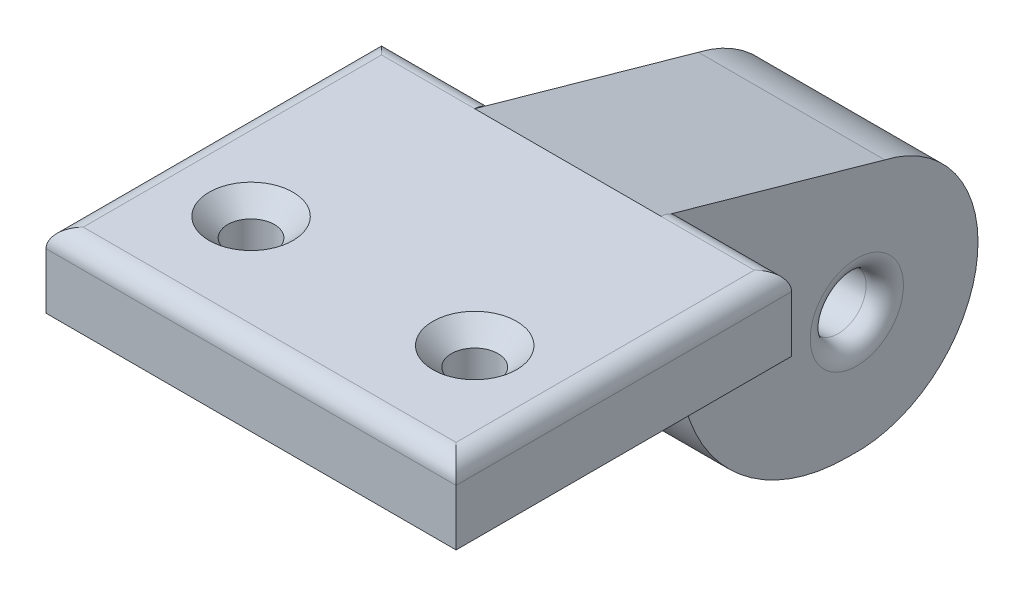
ISO-10303-21;
HEADER;
FILE_DESCRIPTION(('STEP AP214'),'2;1');
FILE_NAME('part.step','',(''),(''),'','','');
FILE_SCHEMA(('AUTOMOTIVE_DESIGN { 1 0 10303 214 1 1 1 1 }'));
ENDSEC;
DATA;
#1=APPLICATION_CONTEXT('core data for automotive mechanical design processes');
#2=APPLICATION_PROTOCOL_DEFINITION('international standard','automotive_design',2000,#1);
#3=PRODUCT_CONTEXT('',#1,'mechanical');
#4=PRODUCT('Part','Part','',(#3));
#5=PRODUCT_RELATED_PRODUCT_CATEGORY('part','',(#4));
#6=PRODUCT_DEFINITION_FORMATION('','',#4);
#7=PRODUCT_DEFINITION_CONTEXT('part definition',#1,'design');
#8=PRODUCT_DEFINITION('design','',#6,#7);
#9=PRODUCT_DEFINITION_SHAPE('','',#8);
#10=(LENGTH_UNIT() NAMED_UNIT(*) SI_UNIT(.MILLI.,.METRE.));
#11=(NAMED_UNIT(*) PLANE_ANGLE_UNIT() SI_UNIT($,.RADIAN.));
#12=(NAMED_UNIT(*) SI_UNIT($,.STERADIAN.) SOLID_ANGLE_UNIT());
#13=UNCERTAINTY_MEASURE_WITH_UNIT(LENGTH_MEASURE(1.E-05),#10,'distance_accuracy_value','');
#14=(GEOMETRIC_REPRESENTATION_CONTEXT(3) GLOBAL_UNCERTAINTY_ASSIGNED_CONTEXT((#13)) GLOBAL_UNIT_ASSIGNED_CONTEXT((#10,
#11,#12)) REPRESENTATION_CONTEXT('',''));
#15=CARTESIAN_POINT('',(0.,0.,0.));
#16=DIRECTION('',(0.,0.,1.));
#17=DIRECTION('',(1.,0.,0.));
#18=AXIS2_PLACEMENT_3D('',#15,#16,#17);
#19=CARTESIAN_POINT('',(0.,0.,0.));
#20=DIRECTION('',(0.,1.,0.));
#21=DIRECTION('',(0.,0.,1.));
#22=AXIS2_PLACEMENT_3D('',#19,#20,#21);
#23=PLANE('',#22);
#24=CARTESIAN_POINT('',(-2.24087591240878,0.,-13.3576642335766));
#25=DIRECTION('',(0.,1.,0.));
#26=DIRECTION('',(0.,0.,1.));
#27=AXIS2_PLACEMENT_3D('',#24,#25,#26);
#28=CIRCLE('',#27,1.2484307583388);
#29=CARTESIAN_POINT('',(-2.24087591240878,0.,-12.1092334752378));
#30=VERTEX_POINT('',#29);
#31=EDGE_CURVE('E350',#30,#30,#28,.T.);
#32=ORIENTED_EDGE('',*,*,#31,.T.);
#33=EDGE_LOOP('',(#32));
#34=FACE_BOUND('',#33,.T.);
#35=CARTESIAN_POINT('',(-14.2408759124088,0.,-13.3576642335766));
#36=DIRECTION('',(0.,1.,0.));
#37=DIRECTION('',(0.,0.,1.));
#38=AXIS2_PLACEMENT_3D('',#35,#36,#37);
#39=CIRCLE('',#38,1.2484307583388);
#40=CARTESIAN_POINT('',(-14.2408759124088,0.,-12.1092334752378));
#41=VERTEX_POINT('',#40);
#42=EDGE_CURVE('E289',#41,#41,#39,.T.);
#43=ORIENTED_EDGE('',*,*,#42,.T.);
#44=EDGE_LOOP('',(#43));
#45=FACE_BOUND('',#44,.T.);
#46=DIRECTION('',(1.,0.,0.));
#47=VECTOR('',#46,1.);
#48=CARTESIAN_POINT('',(0.,0.,-23.3576642335766));
#49=LINE('',#48,#47);
#50=CARTESIAN_POINT('',(-13.2408759124088,0.,-23.3576642335766));
#51=VERTEX_POINT('',#50);
#52=CARTESIAN_POINT('',(-3.24087591240879,0.,-23.3576642335766));
#53=VERTEX_POINT('',#52);
#54=EDGE_CURVE('E293',#51,#53,#49,.T.);
#55=ORIENTED_EDGE('',*,*,#54,.T.);
#56=DIRECTION('',(0.,0.,-1.));
#57=VECTOR('',#56,1.);
#58=CARTESIAN_POINT('',(-3.24087591240878,0.,0.));
#59=LINE('',#58,#57);
#60=CARTESIAN_POINT('',(-3.24087591240879,0.,-25.3576642335766));
#61=VERTEX_POINT('',#60);
#62=EDGE_CURVE('E297',#53,#61,#59,.T.);
#63=ORIENTED_EDGE('',*,*,#62,.T.);
#64=DIRECTION('',(1.,0.,0.));
#65=VECTOR('',#64,1.);
#66=CARTESIAN_POINT('',(0.,0.,-25.3576642335766));
#67=LINE('',#66,#65);
#68=CARTESIAN_POINT('',(2.75912408759122,0.,-25.3576642335766));
#69=VERTEX_POINT('',#68);
#70=EDGE_CURVE('E198',#61,#69,#67,.T.);
#71=ORIENTED_EDGE('',*,*,#70,.T.);
#72=DIRECTION('',(0.,0.,1.));
#73=VECTOR('',#72,1.);
#74=CARTESIAN_POINT('',(2.75912408759122,0.,0.));
#75=LINE('',#74,#73);
#76=CARTESIAN_POINT('',(2.75912408759122,0.,-7.35766423357664));
#77=VERTEX_POINT('',#76);
#78=EDGE_CURVE('E180',#69,#77,#75,.T.);
#79=ORIENTED_EDGE('',*,*,#78,.T.);
#80=DIRECTION('',(1.,0.,0.));
#81=VECTOR('',#80,1.);
#82=CARTESIAN_POINT('',(0.,0.,-7.35766423357664));
#83=LINE('',#82,#81);
#84=CARTESIAN_POINT('',(-19.2408759124088,0.,-7.35766423357664));
#85=VERTEX_POINT('',#84);
#86=EDGE_CURVE('E202',#85,#77,#83,.T.);
#87=ORIENTED_EDGE('',*,*,#86,.F.);
#88=DIRECTION('',(0.,0.,1.));
#89=VECTOR('',#88,1.);
#90=CARTESIAN_POINT('',(-19.2408759124088,0.,0.));
#91=LINE('',#90,#89);
#92=CARTESIAN_POINT('',(-19.2408759124088,0.,-25.3576642335766));
#93=VERTEX_POINT('',#92);
#94=EDGE_CURVE('E367',#93,#85,#91,.T.);
#95=ORIENTED_EDGE('',*,*,#94,.F.);
#96=DIRECTION('',(-1.,0.,0.));
#97=VECTOR('',#96,1.);
#98=CARTESIAN_POINT('',(-16.4817518248176,0.,-25.3576642335766));
#99=LINE('',#98,#97);
#100=CARTESIAN_POINT('',(-13.2408759124088,0.,-25.3576642335766));
#101=VERTEX_POINT('',#100);
#102=EDGE_CURVE('E371',#101,#93,#99,.T.);
#103=ORIENTED_EDGE('',*,*,#102,.F.);
#104=DIRECTION('',(0.,0.,1.));
#105=VECTOR('',#104,1.);
#106=CARTESIAN_POINT('',(-13.2408759124088,0.,0.));
#107=LINE('',#106,#105);
#108=EDGE_CURVE('E273',#101,#51,#107,.T.);
#109=ORIENTED_EDGE('',*,*,#108,.T.);
#110=EDGE_LOOP('',(#55,#63,#71,#79,#87,#95,#103,#109));
#111=FACE_BOUND('',#110,.T.);
#112=ADVANCED_FACE('F43',(#34,#45,#111),#23,.F.);
#113=CARTESIAN_POINT('',(2.75912408759122,4.,0.));
#114=DIRECTION('',(1.,0.,0.));
#115=DIRECTION('',(0.,0.,-1.));
#116=AXIS2_PLACEMENT_3D('',#113,#114,#115);
#117=PLANE('',#116);
#118=DIRECTION('',(0.,-1.,0.));
#119=VECTOR('',#118,1.);
#120=CARTESIAN_POINT('',(2.75912408759122,4.,-25.3576642335766));
#121=LINE('',#120,#119);
#122=CARTESIAN_POINT('',(2.75912408759122,3.,-25.3576642335766));
#123=VERTEX_POINT('',#122);
#124=EDGE_CURVE('E213',#123,#69,#121,.T.);
#125=ORIENTED_EDGE('',*,*,#124,.F.);
#126=DIRECTION('',(0.,0.,1.));
#127=VECTOR('',#126,1.);
#128=CARTESIAN_POINT('',(2.75912408759122,3.,0.));
#129=LINE('',#128,#127);
#130=CARTESIAN_POINT('',(2.75912408759122,3.,-7.35766423357664));
#131=VERTEX_POINT('',#130);
#132=EDGE_CURVE('E236',#123,#131,#129,.T.);
#133=ORIENTED_EDGE('',*,*,#132,.T.);
#134=DIRECTION('',(0.,-1.,0.));
#135=VECTOR('',#134,1.);
#136=CARTESIAN_POINT('',(2.75912408759122,4.,-7.35766423357664));
#137=LINE('',#136,#135);
#138=EDGE_CURVE('E206',#131,#77,#137,.T.);
#139=ORIENTED_EDGE('',*,*,#138,.T.);
#140=ORIENTED_EDGE('',*,*,#78,.F.);
#141=EDGE_LOOP('',(#125,#133,#139,#140));
#142=FACE_BOUND('',#141,.T.);
#143=ADVANCED_FACE('F435',(#142),#117,.T.);
#144=CARTESIAN_POINT('',(0.,4.,-25.3576642335766));
#145=DIRECTION('',(0.,0.,-1.));
#146=DIRECTION('',(-1.,0.,0.));
#147=AXIS2_PLACEMENT_3D('',#144,#145,#146);
#148=PLANE('',#147);
#149=DIRECTION('',(0.,-1.,0.));
#150=VECTOR('',#149,1.);
#151=CARTESIAN_POINT('',(-3.24087591240879,4.,-25.3576642335766));
#152=LINE('',#151,#150);
#153=CARTESIAN_POINT('',(-3.24087591240879,3.,-25.3576642335766));
#154=VERTEX_POINT('',#153);
#155=EDGE_CURVE('E209',#154,#61,#152,.T.);
#156=ORIENTED_EDGE('',*,*,#155,.F.);
#157=DIRECTION('',(1.,0.,0.));
#158=VECTOR('',#157,1.);
#159=CARTESIAN_POINT('',(0.,3.,-25.3576642335766));
#160=LINE('',#159,#158);
#161=EDGE_CURVE('E216',#154,#123,#160,.T.);
#162=ORIENTED_EDGE('',*,*,#161,.T.);
#163=ORIENTED_EDGE('',*,*,#124,.T.);
#164=ORIENTED_EDGE('',*,*,#70,.F.);
#165=EDGE_LOOP('',(#156,#162,#163,#164));
#166=FACE_BOUND('',#165,.T.);
#167=ADVANCED_FACE('F423',(#166),#148,.T.);
#168=CARTESIAN_POINT('',(-3.24087591240878,4.,0.));
#169=DIRECTION('',(-1.,0.,0.));
#170=DIRECTION('',(0.,0.,1.));
#171=AXIS2_PLACEMENT_3D('',#168,#169,#170);
#172=PLANE('',#171);
#173=CARTESIAN_POINT('',(-3.24087591240879,-5.7,-34.8576642335766));
#174=DIRECTION('',(-1.,0.,0.));
#175=DIRECTION('',(0.,0.,1.));
#176=AXIS2_PLACEMENT_3D('',#173,#174,#175);
#177=CIRCLE('',#176,2.5);
#178=CARTESIAN_POINT('',(-3.24087591240879,-5.7,-32.3576642335766));
#179=VERTEX_POINT('',#178);
#180=EDGE_CURVE('E260',#179,#179,#177,.T.);
#181=ORIENTED_EDGE('',*,*,#180,.T.);
#182=EDGE_LOOP('',(#181));
#183=FACE_BOUND('',#182,.T.);
#184=CARTESIAN_POINT('',(-3.24087591240879,-5.7,-34.8576642335766));
#185=DIRECTION('',(1.,0.,0.));
#186=DIRECTION('',(0.,0.,-1.));
#187=AXIS2_PLACEMENT_3D('',#184,#185,#186);
#188=CIRCLE('',#187,6.5);
#189=CARTESIAN_POINT('',(-3.24087591240879,-12.1921305013964,-34.5379119031099));
#190=VERTEX_POINT('',#189);
#191=CARTESIAN_POINT('',(-3.24087591240879,0.624555320336759,-36.3576642335766));
#192=VERTEX_POINT('',#191);
#193=EDGE_CURVE('E176',#190,#192,#188,.T.);
#194=ORIENTED_EDGE('',*,*,#193,.T.);
#195=DIRECTION('',(0.,0.270778634132189,0.962641642199997));
#196=VECTOR('',#195,1.);
#197=CARTESIAN_POINT('',(-3.24087591240879,0.624555320336759,-36.3576642335766));
#198=LINE('',#197,#196);
#199=CARTESIAN_POINT('',(-3.24087591240879,3.85335786259501,-24.878989811644));
#200=VERTEX_POINT('',#199);
#201=EDGE_CURVE('E158',#192,#200,#198,.T.);
#202=ORIENTED_EDGE('',*,*,#201,.T.);
#203=CARTESIAN_POINT('',(-3.24087591240879,3.,-24.3576642335766));
#204=DIRECTION('',(-1.,0.,0.));
#205=DIRECTION('',(0.,0.,1.));
#206=AXIS2_PLACEMENT_3D('',#203,#204,#205);
#207=CIRCLE('',#206,1.);
#208=EDGE_CURVE('E264',#200,#154,#207,.T.);
#209=ORIENTED_EDGE('',*,*,#208,.T.);
#210=ORIENTED_EDGE('',*,*,#155,.T.);
#211=ORIENTED_EDGE('',*,*,#62,.F.);
#212=CARTESIAN_POINT('',(-3.24087591240879,-2.,-23.3576642335766));
#213=DIRECTION('',(-1.,0.,0.));
#214=DIRECTION('',(0.,0.,1.));
#215=AXIS2_PLACEMENT_3D('',#212,#213,#214);
#216=CIRCLE('',#215,2.);
#217=CARTESIAN_POINT('',(-3.24087591240879,-2.,-25.3576642335766));
#218=VERTEX_POINT('',#217);
#219=EDGE_CURVE('E303',#53,#218,#216,.T.);
#220=ORIENTED_EDGE('',*,*,#219,.T.);
#221=DIRECTION('',(0.,-1.,0.));
#222=VECTOR('',#221,1.);
#223=CARTESIAN_POINT('',(-3.24087591240879,0.,-25.3576642335766));
#224=LINE('',#223,#222);
#225=CARTESIAN_POINT('',(-3.24087591240879,-3.19213050139637,-25.3576642335766));
#226=VERTEX_POINT('',#225);
#227=EDGE_CURVE('E191',#218,#226,#224,.T.);
#228=ORIENTED_EDGE('',*,*,#227,.T.);
#229=CARTESIAN_POINT('',(-3.24087591240879,-3.19213050139637,-34.3576642335766));
#230=DIRECTION('',(-1.,0.,0.));
#231=DIRECTION('',(0.,0.,1.));
#232=AXIS2_PLACEMENT_3D('',#229,#230,#231);
#233=CIRCLE('',#232,9.);
#234=CARTESIAN_POINT('',(-3.24087591240879,-12.1921305013964,-34.3576642335766));
#235=VERTEX_POINT('',#234);
#236=EDGE_CURVE('E68',#226,#235,#233,.F.);
#237=ORIENTED_EDGE('',*,*,#236,.T.);
#238=DIRECTION('',(0.,0.,-1.));
#239=VECTOR('',#238,1.);
#240=CARTESIAN_POINT('',(-3.24087591240878,-12.1921305013964,0.));
#241=LINE('',#240,#239);
#242=EDGE_CURVE('E184',#235,#190,#241,.T.);
#243=ORIENTED_EDGE('',*,*,#242,.T.);
#244=EDGE_LOOP('',(#194,#202,#209,#210,#211,#220,#228,#237,#243));
#245=FACE_BOUND('',#244,.T.);
#246=ADVANCED_FACE('F183',(#183,#245),#172,.F.);
#247=CARTESIAN_POINT('',(0.,4.,-7.35766423357664));
#248=DIRECTION('',(0.,0.,-1.));
#249=DIRECTION('',(-1.,0.,0.));
#250=AXIS2_PLACEMENT_3D('',#247,#248,#249);
#251=PLANE('',#250);
#252=ORIENTED_EDGE('',*,*,#138,.F.);
#253=DIRECTION('',(1.,0.,0.));
#254=VECTOR('',#253,1.);
#255=CARTESIAN_POINT('',(-19.2408759124088,3.,-7.35766423357664));
#256=LINE('',#255,#254);
#257=CARTESIAN_POINT('',(-19.2408759124088,3.,-7.35766423357664));
#258=VERTEX_POINT('',#257);
#259=EDGE_CURVE('E239',#131,#258,#256,.F.);
#260=ORIENTED_EDGE('',*,*,#259,.T.);
#261=DIRECTION('',(0.,-1.,0.));
#262=VECTOR('',#261,1.);
#263=CARTESIAN_POINT('',(-19.2408759124088,4.,-7.35766423357664));
#264=LINE('',#263,#262);
#265=EDGE_CURVE('E382',#258,#85,#264,.T.);
#266=ORIENTED_EDGE('',*,*,#265,.T.);
#267=ORIENTED_EDGE('',*,*,#86,.T.);
#268=EDGE_LOOP('',(#252,#260,#266,#267));
#269=FACE_BOUND('',#268,.T.);
#270=ADVANCED_FACE('F439',(#269),#251,.F.);
#271=CARTESIAN_POINT('',(0.,4.,0.));
#272=DIRECTION('',(0.,1.,0.));
#273=DIRECTION('',(0.,0.,1.));
#274=AXIS2_PLACEMENT_3D('',#271,#272,#273);
#275=PLANE('',#274);
#276=CARTESIAN_POINT('',(-14.2408759124088,4.,-13.3576642335766));
#277=DIRECTION('',(0.,1.,0.));
#278=DIRECTION('',(0.,0.,1.));
#279=AXIS2_PLACEMENT_3D('',#276,#277,#278);
#280=CIRCLE('',#279,2.2484307583388);
#281=CARTESIAN_POINT('',(-14.2408759124088,4.,-11.1092334752378));
#282=VERTEX_POINT('',#281);
#283=EDGE_CURVE('E53',#282,#282,#280,.F.);
#284=ORIENTED_EDGE('',*,*,#283,.T.);
#285=EDGE_LOOP('',(#284));
#286=FACE_BOUND('',#285,.T.);
#287=CARTESIAN_POINT('',(-2.24087591240878,4.,-13.3576642335766));
#288=DIRECTION('',(0.,1.,0.));
#289=DIRECTION('',(0.,0.,1.));
#290=AXIS2_PLACEMENT_3D('',#287,#288,#289);
#291=CIRCLE('',#290,2.2484307583388);
#292=CARTESIAN_POINT('',(-2.24087591240878,4.,-11.1092334752378));
#293=VERTEX_POINT('',#292);
#294=EDGE_CURVE('E324',#293,#293,#291,.F.);
#295=ORIENTED_EDGE('',*,*,#294,.T.);
#296=EDGE_LOOP('',(#295));
#297=FACE_BOUND('',#296,.T.);
#298=DIRECTION('',(-1.,0.,0.));
#299=VECTOR('',#298,1.);
#300=CARTESIAN_POINT('',(-3.24087591240879,4.,-24.3576642335766));
#301=LINE('',#300,#299);
#302=CARTESIAN_POINT('',(-3.24087591240879,4.,-24.3576642335766));
#303=VERTEX_POINT('',#302);
#304=CARTESIAN_POINT('',(-13.2408759124088,4.,-24.3576642335766));
#305=VERTEX_POINT('',#304);
#306=EDGE_CURVE('E169',#303,#305,#301,.T.);
#307=ORIENTED_EDGE('',*,*,#306,.T.);
#308=DIRECTION('',(-1.,0.,0.));
#309=VECTOR('',#308,1.);
#310=CARTESIAN_POINT('',(-19.2408759124088,4.,-24.3576642335766));
#311=LINE('',#310,#309);
#312=CARTESIAN_POINT('',(-18.2408759124088,4.,-24.3576642335766));
#313=VERTEX_POINT('',#312);
#314=EDGE_CURVE('E223',#305,#313,#311,.T.);
#315=ORIENTED_EDGE('',*,*,#314,.T.);
#316=DIRECTION('',(0.,0.,1.));
#317=VECTOR('',#316,1.);
#318=CARTESIAN_POINT('',(-18.2408759124088,4.,-7.35766423357664));
#319=LINE('',#318,#317);
#320=CARTESIAN_POINT('',(-18.2408759124088,4.,-8.35766423357664));
#321=VERTEX_POINT('',#320);
#322=EDGE_CURVE('E220',#313,#321,#319,.T.);
#323=ORIENTED_EDGE('',*,*,#322,.T.);
#324=DIRECTION('',(1.,0.,0.));
#325=VECTOR('',#324,1.);
#326=CARTESIAN_POINT('',(2.75912408759122,4.,-8.35766423357664));
#327=LINE('',#326,#325);
#328=CARTESIAN_POINT('',(1.75912408759122,4.,-8.35766423357664));
#329=VERTEX_POINT('',#328);
#330=EDGE_CURVE('E226',#321,#329,#327,.T.);
#331=ORIENTED_EDGE('',*,*,#330,.T.);
#332=DIRECTION('',(0.,0.,1.));
#333=VECTOR('',#332,1.);
#334=CARTESIAN_POINT('',(1.75912408759122,4.,0.));
#335=LINE('',#334,#333);
#336=CARTESIAN_POINT('',(1.75912408759122,4.,-24.3576642335766));
#337=VERTEX_POINT('',#336);
#338=EDGE_CURVE('E229',#329,#337,#335,.F.);
#339=ORIENTED_EDGE('',*,*,#338,.T.);
#340=DIRECTION('',(1.,0.,0.));
#341=VECTOR('',#340,1.);
#342=CARTESIAN_POINT('',(0.,4.,-24.3576642335766));
#343=LINE('',#342,#341);
#344=EDGE_CURVE('E232',#337,#303,#343,.F.);
#345=ORIENTED_EDGE('',*,*,#344,.T.);
#346=EDGE_LOOP('',(#307,#315,#323,#331,#339,#345));
#347=FACE_BOUND('',#346,.T.);
#348=ADVANCED_FACE('F331',(#286,#297,#347),#275,.T.);
#349=CARTESIAN_POINT('',(-8.24087591240879,-5.7,-34.8576642335766));
#350=DIRECTION('',(1.,0.,0.));
#351=DIRECTION('',(0.,0.,-1.));
#352=AXIS2_PLACEMENT_3D('',#349,#350,#351);
#353=CYLINDRICAL_SURFACE('',#352,6.5);
#354=ORIENTED_EDGE('',*,*,#193,.F.);
#355=DIRECTION('',(1.,0.,0.));
#356=VECTOR('',#355,1.);
#357=CARTESIAN_POINT('',(-8.24087591240879,-12.1921305013964,-34.5379119031099));
#358=LINE('',#357,#356);
#359=CARTESIAN_POINT('',(-13.2408759124088,-12.1921305013964,-34.5379119031099));
#360=VERTEX_POINT('',#359);
#361=EDGE_CURVE('E181',#360,#190,#358,.T.);
#362=ORIENTED_EDGE('',*,*,#361,.F.);
#363=CARTESIAN_POINT('',(-13.2408759124088,-5.7,-34.8576642335766));
#364=DIRECTION('',(1.,0.,0.));
#365=DIRECTION('',(0.,0.,-1.));
#366=AXIS2_PLACEMENT_3D('',#363,#364,#365);
#367=CIRCLE('',#366,6.5);
#368=CARTESIAN_POINT('',(-13.2408759124088,0.624555320336759,-36.3576642335766));
#369=VERTEX_POINT('',#368);
#370=EDGE_CURVE('E178',#360,#369,#367,.T.);
#371=ORIENTED_EDGE('',*,*,#370,.T.);
#372=DIRECTION('',(1.,0.,0.));
#373=VECTOR('',#372,1.);
#374=CARTESIAN_POINT('',(-8.24087591240879,0.624555320336759,-36.3576642335766));
#375=LINE('',#374,#373);
#376=EDGE_CURVE('E162',#369,#192,#375,.T.);
#377=ORIENTED_EDGE('',*,*,#376,.T.);
#378=EDGE_LOOP('',(#354,#362,#371,#377));
#379=FACE_BOUND('',#378,.T.);
#380=ADVANCED_FACE('F174',(#379),#353,.T.);
#381=CARTESIAN_POINT('',(-8.24087591240879,-12.1921305013964,0.));
#382=DIRECTION('',(0.,-1.,0.));
#383=DIRECTION('',(0.,0.,-1.));
#384=AXIS2_PLACEMENT_3D('',#381,#382,#383);
#385=PLANE('',#384);
#386=ORIENTED_EDGE('',*,*,#242,.F.);
#387=DIRECTION('',(1.,0.,0.));
#388=VECTOR('',#387,1.);
#389=CARTESIAN_POINT('',(-8.24087591240879,-12.1921305013964,-34.3576642335766));
#390=LINE('',#389,#388);
#391=CARTESIAN_POINT('',(-13.2408759124088,-12.1921305013964,-34.3576642335766));
#392=VERTEX_POINT('',#391);
#393=EDGE_CURVE('E60',#235,#392,#390,.F.);
#394=ORIENTED_EDGE('',*,*,#393,.T.);
#395=DIRECTION('',(0.,0.,-1.));
#396=VECTOR('',#395,1.);
#397=CARTESIAN_POINT('',(-13.2408759124088,-12.1921305013964,0.));
#398=LINE('',#397,#396);
#399=EDGE_CURVE('E360',#392,#360,#398,.T.);
#400=ORIENTED_EDGE('',*,*,#399,.T.);
#401=ORIENTED_EDGE('',*,*,#361,.T.);
#402=EDGE_LOOP('',(#386,#394,#400,#401));
#403=FACE_BOUND('',#402,.T.);
#404=ADVANCED_FACE('F512',(#403),#385,.T.);
#405=CARTESIAN_POINT('',(-8.24087591240879,0.,-25.3576642335766));
#406=DIRECTION('',(0.,0.,1.));
#407=DIRECTION('',(1.,0.,0.));
#408=AXIS2_PLACEMENT_3D('',#405,#406,#407);
#409=PLANE('',#408);
#410=DIRECTION('',(0.,-1.,0.));
#411=VECTOR('',#410,1.);
#412=CARTESIAN_POINT('',(-13.2408759124088,0.,-25.3576642335766));
#413=LINE('',#412,#411);
#414=CARTESIAN_POINT('',(-13.2408759124088,-2.,-25.3576642335766));
#415=VERTEX_POINT('',#414);
#416=CARTESIAN_POINT('',(-13.2408759124088,-3.19213050139637,-25.3576642335766));
#417=VERTEX_POINT('',#416);
#418=EDGE_CURVE('E363',#415,#417,#413,.T.);
#419=ORIENTED_EDGE('',*,*,#418,.T.);
#420=DIRECTION('',(1.,0.,0.));
#421=VECTOR('',#420,1.);
#422=CARTESIAN_POINT('',(-8.24087591240879,-3.19213050139637,-25.3576642335766));
#423=LINE('',#422,#421);
#424=EDGE_CURVE('E309',#417,#226,#423,.T.);
#425=ORIENTED_EDGE('',*,*,#424,.T.);
#426=ORIENTED_EDGE('',*,*,#227,.F.);
#427=DIRECTION('',(1.,0.,0.));
#428=VECTOR('',#427,1.);
#429=CARTESIAN_POINT('',(-8.24087591240879,-2.,-25.3576642335766));
#430=LINE('',#429,#428);
#431=EDGE_CURVE('E300',#218,#415,#430,.F.);
#432=ORIENTED_EDGE('',*,*,#431,.T.);
#433=EDGE_LOOP('',(#419,#425,#426,#432));
#434=FACE_BOUND('',#433,.T.);
#435=ADVANCED_FACE('F389',(#434),#409,.T.);
#436=CARTESIAN_POINT('',(-8.24087591240879,-5.7,-34.8576642335766));
#437=DIRECTION('',(1.,0.,0.));
#438=DIRECTION('',(0.,0.,-1.));
#439=AXIS2_PLACEMENT_3D('',#436,#437,#438);
#440=CYLINDRICAL_SURFACE('',#439,1.5);
#441=CARTESIAN_POINT('',(-12.2408759124088,-5.7,-34.8576642335766));
#442=DIRECTION('',(-1.,0.,0.));
#443=DIRECTION('',(0.,0.,1.));
#444=AXIS2_PLACEMENT_3D('',#441,#442,#443);
#445=CIRCLE('',#444,1.5);
#446=CARTESIAN_POINT('',(-12.2408759124088,-5.7,-33.3576642335766));
#447=VERTEX_POINT('',#446);
#448=EDGE_CURVE('E256',#447,#447,#445,.T.);
#449=ORIENTED_EDGE('',*,*,#448,.T.);
#450=EDGE_LOOP('',(#449));
#451=FACE_BOUND('',#450,.T.);
#452=CARTESIAN_POINT('',(-4.24087591240879,-5.7,-34.8576642335766));
#453=DIRECTION('',(-1.,0.,0.));
#454=DIRECTION('',(0.,0.,1.));
#455=AXIS2_PLACEMENT_3D('',#452,#453,#454);
#456=CIRCLE('',#455,1.5);
#457=CARTESIAN_POINT('',(-4.24087591240879,-5.7,-33.3576642335766));
#458=VERTEX_POINT('',#457);
#459=EDGE_CURVE('E252',#458,#458,#456,.F.);
#460=ORIENTED_EDGE('',*,*,#459,.T.);
#461=EDGE_LOOP('',(#460));
#462=FACE_BOUND('',#461,.T.);
#463=ADVANCED_FACE('F452',(#451,#462),#440,.F.);
#464=CARTESIAN_POINT('',(-19.2408759124088,4.,0.));
#465=DIRECTION('',(1.,0.,0.));
#466=DIRECTION('',(0.,0.,-1.));
#467=AXIS2_PLACEMENT_3D('',#464,#465,#466);
#468=PLANE('',#467);
#469=ORIENTED_EDGE('',*,*,#265,.F.);
#470=DIRECTION('',(0.,0.,1.));
#471=VECTOR('',#470,1.);
#472=CARTESIAN_POINT('',(-19.2408759124088,3.,-25.3576642335766));
#473=LINE('',#472,#471);
#474=CARTESIAN_POINT('',(-19.2408759124088,3.,-25.3576642335766));
#475=VERTEX_POINT('',#474);
#476=EDGE_CURVE('E245',#258,#475,#473,.F.);
#477=ORIENTED_EDGE('',*,*,#476,.T.);
#478=DIRECTION('',(0.,-1.,0.));
#479=VECTOR('',#478,1.);
#480=CARTESIAN_POINT('',(-19.2408759124088,4.,-25.3576642335766));
#481=LINE('',#480,#479);
#482=EDGE_CURVE('E375',#475,#93,#481,.T.);
#483=ORIENTED_EDGE('',*,*,#482,.T.);
#484=ORIENTED_EDGE('',*,*,#94,.T.);
#485=EDGE_LOOP('',(#469,#477,#483,#484));
#486=FACE_BOUND('',#485,.T.);
#487=ADVANCED_FACE('F450',(#486),#468,.F.);
#488=CARTESIAN_POINT('',(-13.2408759124088,4.,0.));
#489=DIRECTION('',(-1.,0.,0.));
#490=DIRECTION('',(0.,0.,1.));
#491=AXIS2_PLACEMENT_3D('',#488,#489,#490);
#492=PLANE('',#491);
#493=DIRECTION('',(0.,0.270778634132189,0.962641642199997));
#494=VECTOR('',#493,1.);
#495=CARTESIAN_POINT('',(-13.2408759124088,0.624555320336759,-36.3576642335766));
#496=LINE('',#495,#494);
#497=CARTESIAN_POINT('',(-13.2408759124088,3.85335786259501,-24.878989811644));
#498=VERTEX_POINT('',#497);
#499=EDGE_CURVE('E758',#369,#498,#496,.T.);
#500=ORIENTED_EDGE('',*,*,#499,.F.);
#501=ORIENTED_EDGE('',*,*,#370,.F.);
#502=ORIENTED_EDGE('',*,*,#399,.F.);
#503=CARTESIAN_POINT('',(-13.2408759124088,-3.19213050139637,-34.3576642335766));
#504=DIRECTION('',(-1.,0.,0.));
#505=DIRECTION('',(0.,0.,1.));
#506=AXIS2_PLACEMENT_3D('',#503,#504,#505);
#507=CIRCLE('',#506,9.);
#508=EDGE_CURVE('E317',#392,#417,#507,.T.);
#509=ORIENTED_EDGE('',*,*,#508,.T.);
#510=ORIENTED_EDGE('',*,*,#418,.F.);
#511=CARTESIAN_POINT('',(-13.2408759124088,-2.,-23.3576642335766));
#512=DIRECTION('',(-1.,0.,0.));
#513=DIRECTION('',(0.,0.,1.));
#514=AXIS2_PLACEMENT_3D('',#511,#512,#513);
#515=CIRCLE('',#514,2.);
#516=EDGE_CURVE('E306',#415,#51,#515,.F.);
#517=ORIENTED_EDGE('',*,*,#516,.T.);
#518=ORIENTED_EDGE('',*,*,#108,.F.);
#519=DIRECTION('',(0.,-1.,0.));
#520=VECTOR('',#519,1.);
#521=CARTESIAN_POINT('',(-13.2408759124088,4.,-25.3576642335766));
#522=LINE('',#521,#520);
#523=CARTESIAN_POINT('',(-13.2408759124088,3.,-25.3576642335766));
#524=VERTEX_POINT('',#523);
#525=EDGE_CURVE('E378',#524,#101,#522,.T.);
#526=ORIENTED_EDGE('',*,*,#525,.F.);
#527=CARTESIAN_POINT('',(-13.2408759124088,3.,-24.3576642335766));
#528=DIRECTION('',(-1.,0.,0.));
#529=DIRECTION('',(0.,0.,1.));
#530=AXIS2_PLACEMENT_3D('',#527,#528,#529);
#531=CIRCLE('',#530,1.);
#532=EDGE_CURVE('E269',#524,#498,#531,.F.);
#533=ORIENTED_EDGE('',*,*,#532,.T.);
#534=EDGE_LOOP('',(#500,#501,#502,#509,#510,#517,#518,#526,#533));
#535=FACE_BOUND('',#534,.T.);
#536=CARTESIAN_POINT('',(-13.2408759124088,-5.7,-34.8576642335766));
#537=DIRECTION('',(-1.,0.,0.));
#538=DIRECTION('',(0.,0.,1.));
#539=AXIS2_PLACEMENT_3D('',#536,#537,#538);
#540=CIRCLE('',#539,2.5);
#541=CARTESIAN_POINT('',(-13.2408759124088,-5.7,-32.3576642335766));
#542=VERTEX_POINT('',#541);
#543=EDGE_CURVE('E248',#542,#542,#540,.F.);
#544=ORIENTED_EDGE('',*,*,#543,.T.);
#545=EDGE_LOOP('',(#544));
#546=FACE_BOUND('',#545,.T.);
#547=ADVANCED_FACE('F397',(#535,#546),#492,.T.);
#548=CARTESIAN_POINT('',(-16.4817518248176,4.,-25.3576642335766));
#549=DIRECTION('',(0.,0.,1.));
#550=DIRECTION('',(1.,0.,0.));
#551=AXIS2_PLACEMENT_3D('',#548,#549,#550);
#552=PLANE('',#551);
#553=ORIENTED_EDGE('',*,*,#482,.F.);
#554=DIRECTION('',(-1.,0.,0.));
#555=VECTOR('',#554,1.);
#556=CARTESIAN_POINT('',(-13.2408759124088,3.,-25.3576642335766));
#557=LINE('',#556,#555);
#558=EDGE_CURVE('E242',#475,#524,#557,.F.);
#559=ORIENTED_EDGE('',*,*,#558,.T.);
#560=ORIENTED_EDGE('',*,*,#525,.T.);
#561=ORIENTED_EDGE('',*,*,#102,.T.);
#562=EDGE_LOOP('',(#553,#559,#560,#561));
#563=FACE_BOUND('',#562,.T.);
#564=ADVANCED_FACE('F344',(#563),#552,.F.);
#565=CARTESIAN_POINT('',(-14.2408759124088,-1.,-13.3576642335766));
#566=DIRECTION('',(0.,1.,0.));
#567=DIRECTION('',(0.,0.,1.));
#568=AXIS2_PLACEMENT_3D('',#565,#566,#567);
#569=CYLINDRICAL_SURFACE('',#568,1.2484307583388);
#570=CARTESIAN_POINT('',(-14.2408759124088,3.,-13.3576642335766));
#571=DIRECTION('',(0.,1.,0.));
#572=DIRECTION('',(0.,0.,1.));
#573=AXIS2_PLACEMENT_3D('',#570,#571,#572);
#574=CIRCLE('',#573,1.2484307583388);
#575=CARTESIAN_POINT('',(-14.2408759124088,3.,-12.1092334752378));
#576=VERTEX_POINT('',#575);
#577=EDGE_CURVE('E320',#576,#576,#574,.T.);
#578=ORIENTED_EDGE('',*,*,#577,.T.);
#579=EDGE_LOOP('',(#578));
#580=FACE_BOUND('',#579,.T.);
#581=ORIENTED_EDGE('',*,*,#42,.F.);
#582=EDGE_LOOP('',(#581));
#583=FACE_BOUND('',#582,.T.);
#584=ADVANCED_FACE('F340',(#580,#583),#569,.F.);
#585=CARTESIAN_POINT('',(-2.24087591240878,-1.,-13.3576642335766));
#586=DIRECTION('',(0.,1.,0.));
#587=DIRECTION('',(0.,0.,1.));
#588=AXIS2_PLACEMENT_3D('',#585,#586,#587);
#589=CYLINDRICAL_SURFACE('',#588,1.2484307583388);
#590=CARTESIAN_POINT('',(-2.24087591240878,3.,-13.3576642335766));
#591=DIRECTION('',(0.,1.,0.));
#592=DIRECTION('',(0.,0.,1.));
#593=AXIS2_PLACEMENT_3D('',#590,#591,#592);
#594=CIRCLE('',#593,1.2484307583388);
#595=CARTESIAN_POINT('',(-2.24087591240878,3.,-12.1092334752378));
#596=VERTEX_POINT('',#595);
#597=EDGE_CURVE('E11',#596,#596,#594,.T.);
#598=ORIENTED_EDGE('',*,*,#597,.T.);
#599=EDGE_LOOP('',(#598));
#600=FACE_BOUND('',#599,.T.);
#601=ORIENTED_EDGE('',*,*,#31,.F.);
#602=EDGE_LOOP('',(#601));
#603=FACE_BOUND('',#602,.T.);
#604=ADVANCED_FACE('F343',(#600,#603),#589,.F.);
#605=CARTESIAN_POINT('',(0.,3.,-24.3576642335766));
#606=DIRECTION('',(1.,0.,0.));
#607=DIRECTION('',(0.,0.,-1.));
#608=AXIS2_PLACEMENT_3D('',#605,#606,#607);
#609=CYLINDRICAL_SURFACE('',#608,1.);
#610=ORIENTED_EDGE('',*,*,#532,.F.);
#611=ORIENTED_EDGE('',*,*,#558,.F.);
#612=CARTESIAN_POINT('',(-18.2408759124088,3.,-24.3576642335766));
#613=DIRECTION('',(0.707106781186547,0.,-0.707106781186548));
#614=DIRECTION('',(-0.707106781186548,0.,-0.707106781186547));
#615=AXIS2_PLACEMENT_3D('',#612,#613,#614);
#616=ELLIPSE('',#615,1.41421356237309,1.);
#617=EDGE_CURVE('E285',#313,#475,#616,.F.);
#618=ORIENTED_EDGE('',*,*,#617,.F.);
#619=ORIENTED_EDGE('',*,*,#314,.F.);
#620=EDGE_CURVE('E268',#498,#305,#531,.F.);
#621=ORIENTED_EDGE('',*,*,#620,.F.);
#622=EDGE_LOOP('',(#610,#611,#618,#619,#621));
#623=FACE_BOUND('',#622,.T.);
#624=ADVANCED_FACE('F410',(#623),#609,.T.);
#625=CARTESIAN_POINT('',(-18.2408759124088,3.,0.));
#626=DIRECTION('',(0.,0.,-1.));
#627=DIRECTION('',(-1.,0.,0.));
#628=AXIS2_PLACEMENT_3D('',#625,#626,#627);
#629=CYLINDRICAL_SURFACE('',#628,1.);
#630=ORIENTED_EDGE('',*,*,#617,.T.);
#631=ORIENTED_EDGE('',*,*,#476,.F.);
#632=CARTESIAN_POINT('',(-18.2408759124088,3.,-8.35766423357664));
#633=DIRECTION('',(-0.707106781186548,0.,-0.707106781186547));
#634=DIRECTION('',(0.707106781186547,0.,-0.707106781186548));
#635=AXIS2_PLACEMENT_3D('',#632,#633,#634);
#636=ELLIPSE('',#635,1.41421356237309,1.);
#637=EDGE_CURVE('E281',#321,#258,#636,.F.);
#638=ORIENTED_EDGE('',*,*,#637,.F.);
#639=ORIENTED_EDGE('',*,*,#322,.F.);
#640=EDGE_LOOP('',(#630,#631,#638,#639));
#641=FACE_BOUND('',#640,.T.);
#642=ADVANCED_FACE('F448',(#641),#629,.T.);
#643=CARTESIAN_POINT('',(0.,3.,-8.35766423357664));
#644=DIRECTION('',(-1.,0.,0.));
#645=DIRECTION('',(0.,0.,1.));
#646=AXIS2_PLACEMENT_3D('',#643,#644,#645);
#647=CYLINDRICAL_SURFACE('',#646,1.);
#648=ORIENTED_EDGE('',*,*,#637,.T.);
#649=ORIENTED_EDGE('',*,*,#259,.F.);
#650=CARTESIAN_POINT('',(1.75912408759122,3.,-8.35766423357664));
#651=DIRECTION('',(-0.707106781186547,0.,0.707106781186547));
#652=DIRECTION('',(-0.707106781186547,0.,-0.707106781186547));
#653=AXIS2_PLACEMENT_3D('',#650,#651,#652);
#654=ELLIPSE('',#653,1.41421356237309,1.);
#655=EDGE_CURVE('E277',#329,#131,#654,.F.);
#656=ORIENTED_EDGE('',*,*,#655,.F.);
#657=ORIENTED_EDGE('',*,*,#330,.F.);
#658=EDGE_LOOP('',(#648,#649,#656,#657));
#659=FACE_BOUND('',#658,.T.);
#660=ADVANCED_FACE('F442',(#659),#647,.T.);
#661=CARTESIAN_POINT('',(1.75912408759122,3.,0.));
#662=DIRECTION('',(0.,0.,1.));
#663=DIRECTION('',(1.,0.,0.));
#664=AXIS2_PLACEMENT_3D('',#661,#662,#663);
#665=CYLINDRICAL_SURFACE('',#664,1.);
#666=ORIENTED_EDGE('',*,*,#655,.T.);
#667=ORIENTED_EDGE('',*,*,#132,.F.);
#668=CARTESIAN_POINT('',(1.75912408759122,3.,-24.3576642335766));
#669=DIRECTION('',(0.707106781186547,0.,0.707106781186547));
#670=DIRECTION('',(-0.707106781186547,0.,0.707106781186547));
#671=AXIS2_PLACEMENT_3D('',#668,#669,#670);
#672=ELLIPSE('',#671,1.41421356237309,1.);
#673=EDGE_CURVE('E274',#337,#123,#672,.F.);
#674=ORIENTED_EDGE('',*,*,#673,.F.);
#675=ORIENTED_EDGE('',*,*,#338,.F.);
#676=EDGE_LOOP('',(#666,#667,#674,#675));
#677=FACE_BOUND('',#676,.T.);
#678=ADVANCED_FACE('F431',(#677),#665,.T.);
#679=CARTESIAN_POINT('',(0.,3.,-24.3576642335766));
#680=DIRECTION('',(1.,0.,0.));
#681=DIRECTION('',(0.,0.,-1.));
#682=AXIS2_PLACEMENT_3D('',#679,#680,#681);
#683=CYLINDRICAL_SURFACE('',#682,1.);
#684=EDGE_CURVE('E265',#303,#200,#207,.T.);
#685=ORIENTED_EDGE('',*,*,#684,.F.);
#686=ORIENTED_EDGE('',*,*,#344,.F.);
#687=ORIENTED_EDGE('',*,*,#673,.T.);
#688=ORIENTED_EDGE('',*,*,#161,.F.);
#689=ORIENTED_EDGE('',*,*,#208,.F.);
#690=EDGE_LOOP('',(#685,#686,#687,#688,#689));
#691=FACE_BOUND('',#690,.T.);
#692=ADVANCED_FACE('F425',(#691),#683,.T.);
#693=CARTESIAN_POINT('',(-12.2408759124088,-5.7,-34.8576642335766));
#694=DIRECTION('',(-1.,0.,0.));
#695=DIRECTION('',(0.,0.,1.));
#696=AXIS2_PLACEMENT_3D('',#693,#694,#695);
#697=TOROIDAL_SURFACE('',#696,2.5,1.);
#698=ORIENTED_EDGE('',*,*,#448,.F.);
#699=EDGE_LOOP('',(#698));
#700=FACE_BOUND('',#699,.T.);
#701=ORIENTED_EDGE('',*,*,#543,.F.);
#702=EDGE_LOOP('',(#701));
#703=FACE_BOUND('',#702,.T.);
#704=ADVANCED_FACE('F480',(#700,#703),#697,.T.);
#705=CARTESIAN_POINT('',(-4.24087591240879,-5.7,-34.8576642335766));
#706=DIRECTION('',(-1.,0.,0.));
#707=DIRECTION('',(0.,0.,1.));
#708=AXIS2_PLACEMENT_3D('',#705,#706,#707);
#709=TOROIDAL_SURFACE('',#708,2.5,1.);
#710=ORIENTED_EDGE('',*,*,#180,.F.);
#711=EDGE_LOOP('',(#710));
#712=FACE_BOUND('',#711,.T.);
#713=ORIENTED_EDGE('',*,*,#459,.F.);
#714=EDGE_LOOP('',(#713));
#715=FACE_BOUND('',#714,.T.);
#716=ADVANCED_FACE('F491',(#712,#715),#709,.T.);
#717=CARTESIAN_POINT('',(0.,-2.,-23.3576642335766));
#718=DIRECTION('',(1.,0.,0.));
#719=DIRECTION('',(0.,0.,-1.));
#720=AXIS2_PLACEMENT_3D('',#717,#718,#719);
#721=CYLINDRICAL_SURFACE('',#720,2.);
#722=ORIENTED_EDGE('',*,*,#516,.F.);
#723=ORIENTED_EDGE('',*,*,#431,.F.);
#724=ORIENTED_EDGE('',*,*,#219,.F.);
#725=ORIENTED_EDGE('',*,*,#54,.F.);
#726=EDGE_LOOP('',(#722,#723,#724,#725));
#727=FACE_BOUND('',#726,.T.);
#728=ADVANCED_FACE('F394',(#727),#721,.F.);
#729=CARTESIAN_POINT('',(-8.24087591240879,-3.19213050139637,-34.3576642335766));
#730=DIRECTION('',(1.,0.,0.));
#731=DIRECTION('',(0.,0.,-1.));
#732=AXIS2_PLACEMENT_3D('',#729,#730,#731);
#733=CYLINDRICAL_SURFACE('',#732,9.);
#734=ORIENTED_EDGE('',*,*,#508,.F.);
#735=ORIENTED_EDGE('',*,*,#393,.F.);
#736=ORIENTED_EDGE('',*,*,#236,.F.);
#737=ORIENTED_EDGE('',*,*,#424,.F.);
#738=EDGE_LOOP('',(#734,#735,#736,#737));
#739=FACE_BOUND('',#738,.T.);
#740=ADVANCED_FACE('F498',(#739),#733,.T.);
#741=CARTESIAN_POINT('',(-3.24087591240879,0.624555320336759,-36.3576642335766));
#742=DIRECTION('',(0.,-0.962641642199997,0.270778634132189));
#743=DIRECTION('',(0.,-0.270778634132189,-0.962641642199997));
#744=AXIS2_PLACEMENT_3D('',#741,#742,#743);
#745=PLANE('',#744);
#746=ORIENTED_EDGE('',*,*,#499,.T.);
#747=EDGE_CURVE('E760',#498,#305,#496,.T.);
#748=ORIENTED_EDGE('',*,*,#747,.T.);
#749=ORIENTED_EDGE('',*,*,#306,.F.);
#750=EDGE_CURVE('E165',#200,#303,#198,.T.);
#751=ORIENTED_EDGE('',*,*,#750,.F.);
#752=ORIENTED_EDGE('',*,*,#201,.F.);
#753=ORIENTED_EDGE('',*,*,#376,.F.);
#754=EDGE_LOOP('',(#746,#748,#749,#751,#752,#753));
#755=FACE_BOUND('',#754,.T.);
#756=ADVANCED_FACE('F161',(#755),#745,.F.);
#757=CARTESIAN_POINT('',(-3.24087591240878,0.,0.));
#758=DIRECTION('',(1.,0.,0.));
#759=DIRECTION('',(0.,0.,-1.));
#760=AXIS2_PLACEMENT_3D('',#757,#758,#759);
#761=PLANE('',#760);
#762=ORIENTED_EDGE('',*,*,#684,.T.);
#763=ORIENTED_EDGE('',*,*,#750,.T.);
#764=EDGE_LOOP('',(#762,#763));
#765=FACE_BOUND('',#764,.T.);
#766=ADVANCED_FACE('F509',(#765),#761,.F.);
#767=CARTESIAN_POINT('',(-13.2408759124088,0.,0.));
#768=DIRECTION('',(1.,0.,0.));
#769=DIRECTION('',(0.,0.,-1.));
#770=AXIS2_PLACEMENT_3D('',#767,#768,#769);
#771=PLANE('',#770);
#772=ORIENTED_EDGE('',*,*,#747,.F.);
#773=ORIENTED_EDGE('',*,*,#620,.T.);
#774=EDGE_LOOP('',(#772,#773));
#775=FACE_BOUND('',#774,.T.);
#776=ADVANCED_FACE('F337',(#775),#771,.T.);
#777=CARTESIAN_POINT('',(-14.2408759124088,3.,-13.3576642335766));
#778=DIRECTION('',(0.,1.,0.));
#779=DIRECTION('',(0.,0.,1.));
#780=AXIS2_PLACEMENT_3D('',#777,#778,#779);
#781=CONICAL_SURFACE('',#780,1.2484307583388,0.785398163397447);
#782=ORIENTED_EDGE('',*,*,#283,.F.);
#783=EDGE_LOOP('',(#782));
#784=FACE_BOUND('',#783,.T.);
#785=ORIENTED_EDGE('',*,*,#577,.F.);
#786=EDGE_LOOP('',(#785));
#787=FACE_BOUND('',#786,.T.);
#788=ADVANCED_FACE('F334',(#784,#787),#781,.F.);
#789=CARTESIAN_POINT('',(-2.24087591240878,3.,-13.3576642335766));
#790=DIRECTION('',(0.,1.,0.));
#791=DIRECTION('',(0.,0.,1.));
#792=AXIS2_PLACEMENT_3D('',#789,#790,#791);
#793=CONICAL_SURFACE('',#792,1.2484307583388,0.785398163397448);
#794=ORIENTED_EDGE('',*,*,#294,.F.);
#795=EDGE_LOOP('',(#794));
#796=FACE_BOUND('',#795,.T.);
#797=ORIENTED_EDGE('',*,*,#597,.F.);
#798=EDGE_LOOP('',(#797));
#799=FACE_BOUND('',#798,.T.);
#800=ADVANCED_FACE('F46',(#796,#799),#793,.F.);
#801=CLOSED_SHELL('',(#112,#143,#167,#246,#270,#348,#380,#404,#435,#463,#487,#547,#564,#584,
#604,#624,#642,#660,#678,#692,#704,#716,#728,#740,#756,#766,#776,#788,#800));
#802=MANIFOLD_SOLID_BREP('B2',#801);
#803=ADVANCED_BREP_SHAPE_REPRESENTATION('',(#18,#802),#14);
#804=SHAPE_DEFINITION_REPRESENTATION(#9,#803);
ENDSEC;
END-ISO-10303-21;
